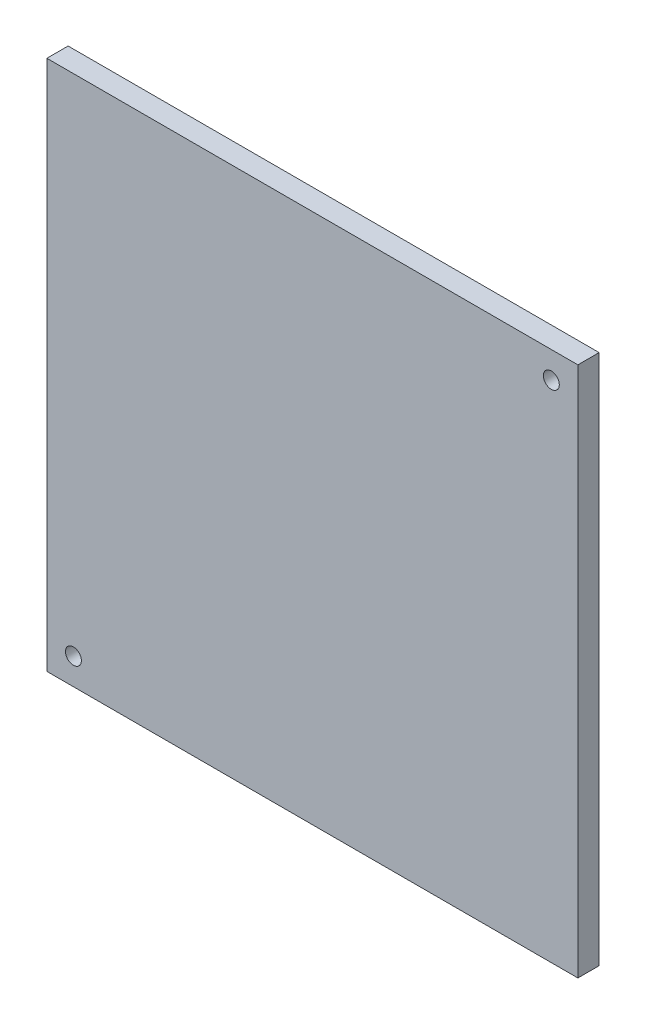
ISO-10303-21;
HEADER;
FILE_DESCRIPTION(('STEP AP214'),'2;1');
FILE_NAME('part.step','',(''),(''),'','','');
FILE_SCHEMA(('AUTOMOTIVE_DESIGN { 1 0 10303 214 1 1 1 1 }'));
ENDSEC;
DATA;
#1=APPLICATION_CONTEXT('core data for automotive mechanical design processes');
#2=APPLICATION_PROTOCOL_DEFINITION('international standard','automotive_design',2000,#1);
#3=PRODUCT_CONTEXT('',#1,'mechanical');
#4=PRODUCT('Part','Part','',(#3));
#5=PRODUCT_RELATED_PRODUCT_CATEGORY('part','',(#4));
#6=PRODUCT_DEFINITION_FORMATION('','',#4);
#7=PRODUCT_DEFINITION_CONTEXT('part definition',#1,'design');
#8=PRODUCT_DEFINITION('design','',#6,#7);
#9=PRODUCT_DEFINITION_SHAPE('','',#8);
#10=(LENGTH_UNIT() NAMED_UNIT(*) SI_UNIT(.MILLI.,.METRE.));
#11=(NAMED_UNIT(*) PLANE_ANGLE_UNIT() SI_UNIT($,.RADIAN.));
#12=(NAMED_UNIT(*) SI_UNIT($,.STERADIAN.) SOLID_ANGLE_UNIT());
#13=UNCERTAINTY_MEASURE_WITH_UNIT(LENGTH_MEASURE(1.E-05),#10,'distance_accuracy_value','');
#14=(GEOMETRIC_REPRESENTATION_CONTEXT(3) GLOBAL_UNCERTAINTY_ASSIGNED_CONTEXT((#13)) GLOBAL_UNIT_ASSIGNED_CONTEXT((#10,
#11,#12)) REPRESENTATION_CONTEXT('',''));
#15=CARTESIAN_POINT('',(0.,0.,0.));
#16=DIRECTION('',(0.,0.,1.));
#17=DIRECTION('',(1.,0.,0.));
#18=AXIS2_PLACEMENT_3D('',#15,#16,#17);
#19=CARTESIAN_POINT('',(-50.,0.,4.));
#20=DIRECTION('',(-1.,0.,0.));
#21=DIRECTION('',(0.,0.,1.));
#22=AXIS2_PLACEMENT_3D('',#19,#20,#21);
#23=PLANE('',#22);
#24=DIRECTION('',(0.,1.,0.));
#25=VECTOR('',#24,1.);
#26=CARTESIAN_POINT('',(-50.,0.,0.));
#27=LINE('',#26,#25);
#28=CARTESIAN_POINT('',(-50.,-50.,0.));
#29=VERTEX_POINT('',#28);
#30=CARTESIAN_POINT('',(-50.,50.,0.));
#31=VERTEX_POINT('',#30);
#32=EDGE_CURVE('E111',#29,#31,#27,.T.);
#33=ORIENTED_EDGE('',*,*,#32,.F.);
#34=DIRECTION('',(0.,0.,-1.));
#35=VECTOR('',#34,1.);
#36=CARTESIAN_POINT('',(-50.,-50.,4.));
#37=LINE('',#36,#35);
#38=CARTESIAN_POINT('',(-50.,-50.,4.));
#39=VERTEX_POINT('',#38);
#40=EDGE_CURVE('E11',#39,#29,#37,.T.);
#41=ORIENTED_EDGE('',*,*,#40,.F.);
#42=DIRECTION('',(0.,1.,0.));
#43=VECTOR('',#42,1.);
#44=CARTESIAN_POINT('',(-50.,0.,4.));
#45=LINE('',#44,#43);
#46=CARTESIAN_POINT('',(-50.,50.,4.));
#47=VERTEX_POINT('',#46);
#48=EDGE_CURVE('E98',#39,#47,#45,.T.);
#49=ORIENTED_EDGE('',*,*,#48,.T.);
#50=DIRECTION('',(0.,0.,-1.));
#51=VECTOR('',#50,1.);
#52=CARTESIAN_POINT('',(-50.,50.,4.));
#53=LINE('',#52,#51);
#54=EDGE_CURVE('E77',#47,#31,#53,.T.);
#55=ORIENTED_EDGE('',*,*,#54,.T.);
#56=EDGE_LOOP('',(#33,#41,#49,#55));
#57=FACE_BOUND('',#56,.T.);
#58=ADVANCED_FACE('F37',(#57),#23,.T.);
#59=CARTESIAN_POINT('',(0.,-50.,4.));
#60=DIRECTION('',(0.,-1.,0.));
#61=DIRECTION('',(0.,0.,-1.));
#62=AXIS2_PLACEMENT_3D('',#59,#60,#61);
#63=PLANE('',#62);
#64=DIRECTION('',(-1.,0.,0.));
#65=VECTOR('',#64,1.);
#66=CARTESIAN_POINT('',(0.,-50.,0.));
#67=LINE('',#66,#65);
#68=CARTESIAN_POINT('',(50.,-50.,0.));
#69=VERTEX_POINT('',#68);
#70=EDGE_CURVE('E89',#69,#29,#67,.T.);
#71=ORIENTED_EDGE('',*,*,#70,.F.);
#72=DIRECTION('',(0.,0.,-1.));
#73=VECTOR('',#72,1.);
#74=CARTESIAN_POINT('',(50.,-50.,4.));
#75=LINE('',#74,#73);
#76=CARTESIAN_POINT('',(50.,-50.,4.));
#77=VERTEX_POINT('',#76);
#78=EDGE_CURVE('E46',#77,#69,#75,.T.);
#79=ORIENTED_EDGE('',*,*,#78,.F.);
#80=DIRECTION('',(-1.,0.,0.));
#81=VECTOR('',#80,1.);
#82=CARTESIAN_POINT('',(0.,-50.,4.));
#83=LINE('',#82,#81);
#84=EDGE_CURVE('E87',#77,#39,#83,.T.);
#85=ORIENTED_EDGE('',*,*,#84,.T.);
#86=ORIENTED_EDGE('',*,*,#40,.T.);
#87=EDGE_LOOP('',(#71,#79,#85,#86));
#88=FACE_BOUND('',#87,.T.);
#89=ADVANCED_FACE('F85',(#88),#63,.T.);
#90=CARTESIAN_POINT('',(50.,0.,4.));
#91=DIRECTION('',(-1.,0.,0.));
#92=DIRECTION('',(0.,0.,1.));
#93=AXIS2_PLACEMENT_3D('',#90,#91,#92);
#94=PLANE('',#93);
#95=DIRECTION('',(0.,1.,0.));
#96=VECTOR('',#95,1.);
#97=CARTESIAN_POINT('',(50.,0.,0.));
#98=LINE('',#97,#96);
#99=CARTESIAN_POINT('',(50.,50.,0.));
#100=VERTEX_POINT('',#99);
#101=EDGE_CURVE('E114',#69,#100,#98,.T.);
#102=ORIENTED_EDGE('',*,*,#101,.T.);
#103=DIRECTION('',(0.,0.,-1.));
#104=VECTOR('',#103,1.);
#105=CARTESIAN_POINT('',(50.,50.,4.));
#106=LINE('',#105,#104);
#107=CARTESIAN_POINT('',(50.,50.,4.));
#108=VERTEX_POINT('',#107);
#109=EDGE_CURVE('E92',#108,#100,#106,.T.);
#110=ORIENTED_EDGE('',*,*,#109,.F.);
#111=DIRECTION('',(0.,1.,0.));
#112=VECTOR('',#111,1.);
#113=CARTESIAN_POINT('',(50.,0.,4.));
#114=LINE('',#113,#112);
#115=EDGE_CURVE('E94',#77,#108,#114,.T.);
#116=ORIENTED_EDGE('',*,*,#115,.F.);
#117=ORIENTED_EDGE('',*,*,#78,.T.);
#118=EDGE_LOOP('',(#102,#110,#116,#117));
#119=FACE_BOUND('',#118,.T.);
#120=ADVANCED_FACE('F95',(#119),#94,.F.);
#121=CARTESIAN_POINT('',(-45.,-45.,4.));
#122=DIRECTION('',(0.,0.,-1.));
#123=DIRECTION('',(-1.,0.,0.));
#124=AXIS2_PLACEMENT_3D('',#121,#122,#123);
#125=CYLINDRICAL_SURFACE('',#124,1.5);
#126=CARTESIAN_POINT('',(-45.,-45.,4.));
#127=DIRECTION('',(0.,0.,1.));
#128=DIRECTION('',(1.,0.,0.));
#129=AXIS2_PLACEMENT_3D('',#126,#127,#128);
#130=CIRCLE('',#129,1.5);
#131=CARTESIAN_POINT('',(-43.5,-45.,4.));
#132=VERTEX_POINT('',#131);
#133=EDGE_CURVE('E100',#132,#132,#130,.T.);
#134=ORIENTED_EDGE('',*,*,#133,.T.);
#135=EDGE_LOOP('',(#134));
#136=FACE_BOUND('',#135,.T.);
#137=CARTESIAN_POINT('',(-45.,-45.,0.));
#138=DIRECTION('',(0.,0.,1.));
#139=DIRECTION('',(1.,0.,0.));
#140=AXIS2_PLACEMENT_3D('',#137,#138,#139);
#141=CIRCLE('',#140,1.5);
#142=CARTESIAN_POINT('',(-43.5,-45.,0.));
#143=VERTEX_POINT('',#142);
#144=EDGE_CURVE('E108',#143,#143,#141,.T.);
#145=ORIENTED_EDGE('',*,*,#144,.F.);
#146=EDGE_LOOP('',(#145));
#147=FACE_BOUND('',#146,.T.);
#148=ADVANCED_FACE('F129',(#136,#147),#125,.F.);
#149=CARTESIAN_POINT('',(45.,45.,4.));
#150=DIRECTION('',(0.,0.,-1.));
#151=DIRECTION('',(-1.,0.,0.));
#152=AXIS2_PLACEMENT_3D('',#149,#150,#151);
#153=CYLINDRICAL_SURFACE('',#152,1.5);
#154=CARTESIAN_POINT('',(45.,45.,4.));
#155=DIRECTION('',(0.,0.,1.));
#156=DIRECTION('',(1.,0.,0.));
#157=AXIS2_PLACEMENT_3D('',#154,#155,#156);
#158=CIRCLE('',#157,1.5);
#159=CARTESIAN_POINT('',(46.5,45.,4.));
#160=VERTEX_POINT('',#159);
#161=EDGE_CURVE('E117',#160,#160,#158,.T.);
#162=ORIENTED_EDGE('',*,*,#161,.T.);
#163=EDGE_LOOP('',(#162));
#164=FACE_BOUND('',#163,.T.);
#165=CARTESIAN_POINT('',(45.,45.,0.));
#166=DIRECTION('',(0.,0.,1.));
#167=DIRECTION('',(1.,0.,0.));
#168=AXIS2_PLACEMENT_3D('',#165,#166,#167);
#169=CIRCLE('',#168,1.5);
#170=CARTESIAN_POINT('',(46.5,45.,0.));
#171=VERTEX_POINT('',#170);
#172=EDGE_CURVE('E105',#171,#171,#169,.T.);
#173=ORIENTED_EDGE('',*,*,#172,.F.);
#174=EDGE_LOOP('',(#173));
#175=FACE_BOUND('',#174,.T.);
#176=ADVANCED_FACE('F39',(#164,#175),#153,.F.);
#177=CARTESIAN_POINT('',(0.,50.,4.));
#178=DIRECTION('',(0.,-1.,0.));
#179=DIRECTION('',(1.,0.,0.));
#180=AXIS2_PLACEMENT_3D('',#177,#178,#179);
#181=PLANE('',#180);
#182=DIRECTION('',(-1.,0.,0.));
#183=VECTOR('',#182,1.);
#184=CARTESIAN_POINT('',(0.,50.,0.));
#185=LINE('',#184,#183);
#186=EDGE_CURVE('E70',#100,#31,#185,.T.);
#187=ORIENTED_EDGE('',*,*,#186,.T.);
#188=ORIENTED_EDGE('',*,*,#54,.F.);
#189=DIRECTION('',(-1.,0.,0.));
#190=VECTOR('',#189,1.);
#191=CARTESIAN_POINT('',(0.,50.,4.));
#192=LINE('',#191,#190);
#193=EDGE_CURVE('E54',#108,#47,#192,.T.);
#194=ORIENTED_EDGE('',*,*,#193,.F.);
#195=ORIENTED_EDGE('',*,*,#109,.T.);
#196=EDGE_LOOP('',(#187,#188,#194,#195));
#197=FACE_BOUND('',#196,.T.);
#198=ADVANCED_FACE('F120',(#197),#181,.F.);
#199=CARTESIAN_POINT('',(0.,0.,4.));
#200=DIRECTION('',(0.,0.,1.));
#201=DIRECTION('',(1.,0.,0.));
#202=AXIS2_PLACEMENT_3D('',#199,#200,#201);
#203=PLANE('',#202);
#204=ORIENTED_EDGE('',*,*,#161,.F.);
#205=EDGE_LOOP('',(#204));
#206=FACE_BOUND('',#205,.T.);
#207=ORIENTED_EDGE('',*,*,#133,.F.);
#208=EDGE_LOOP('',(#207));
#209=FACE_BOUND('',#208,.T.);
#210=ORIENTED_EDGE('',*,*,#48,.F.);
#211=ORIENTED_EDGE('',*,*,#84,.F.);
#212=ORIENTED_EDGE('',*,*,#115,.T.);
#213=ORIENTED_EDGE('',*,*,#193,.T.);
#214=EDGE_LOOP('',(#210,#211,#212,#213));
#215=FACE_BOUND('',#214,.T.);
#216=ADVANCED_FACE('F97',(#206,#209,#215),#203,.T.);
#217=CARTESIAN_POINT('',(0.,0.,0.));
#218=DIRECTION('',(0.,0.,1.));
#219=DIRECTION('',(1.,0.,0.));
#220=AXIS2_PLACEMENT_3D('',#217,#218,#219);
#221=PLANE('',#220);
#222=ORIENTED_EDGE('',*,*,#172,.T.);
#223=EDGE_LOOP('',(#222));
#224=FACE_BOUND('',#223,.T.);
#225=ORIENTED_EDGE('',*,*,#144,.T.);
#226=EDGE_LOOP('',(#225));
#227=FACE_BOUND('',#226,.T.);
#228=ORIENTED_EDGE('',*,*,#32,.T.);
#229=ORIENTED_EDGE('',*,*,#186,.F.);
#230=ORIENTED_EDGE('',*,*,#101,.F.);
#231=ORIENTED_EDGE('',*,*,#70,.T.);
#232=EDGE_LOOP('',(#228,#229,#230,#231));
#233=FACE_BOUND('',#232,.T.);
#234=ADVANCED_FACE('F121',(#224,#227,#233),#221,.F.);
#235=CLOSED_SHELL('',(#58,#89,#120,#148,#176,#198,#216,#234));
#236=MANIFOLD_SOLID_BREP('B2',#235);
#237=ADVANCED_BREP_SHAPE_REPRESENTATION('',(#18,#236),#14);
#238=SHAPE_DEFINITION_REPRESENTATION(#9,#237);
ENDSEC;
END-ISO-10303-21;
